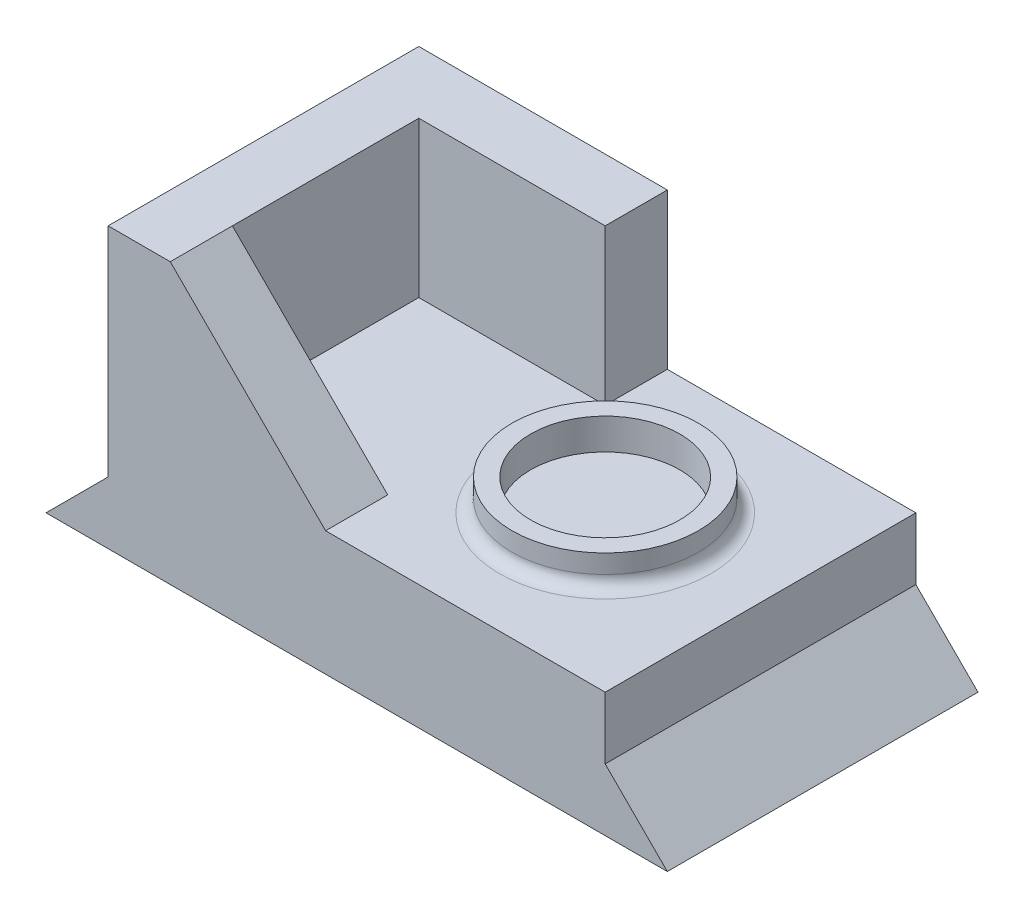
ISO-10303-21;
HEADER;
FILE_DESCRIPTION(('STEP AP214'),'2;1');
FILE_NAME('part.step','',(''),(''),'','','');
FILE_SCHEMA(('AUTOMOTIVE_DESIGN { 1 0 10303 214 1 1 1 1 }'));
ENDSEC;
DATA;
#1=APPLICATION_CONTEXT('core data for automotive mechanical design processes');
#2=APPLICATION_PROTOCOL_DEFINITION('international standard','automotive_design',2000,#1);
#3=PRODUCT_CONTEXT('',#1,'mechanical');
#4=PRODUCT('Part','Part','',(#3));
#5=PRODUCT_RELATED_PRODUCT_CATEGORY('part','',(#4));
#6=PRODUCT_DEFINITION_FORMATION('','',#4);
#7=PRODUCT_DEFINITION_CONTEXT('part definition',#1,'design');
#8=PRODUCT_DEFINITION('design','',#6,#7);
#9=PRODUCT_DEFINITION_SHAPE('','',#8);
#10=(LENGTH_UNIT() NAMED_UNIT(*) SI_UNIT(.MILLI.,.METRE.));
#11=(NAMED_UNIT(*) PLANE_ANGLE_UNIT() SI_UNIT($,.RADIAN.));
#12=(NAMED_UNIT(*) SI_UNIT($,.STERADIAN.) SOLID_ANGLE_UNIT());
#13=UNCERTAINTY_MEASURE_WITH_UNIT(LENGTH_MEASURE(1.E-05),#10,'distance_accuracy_value','');
#14=(GEOMETRIC_REPRESENTATION_CONTEXT(3) GLOBAL_UNCERTAINTY_ASSIGNED_CONTEXT((#13)) GLOBAL_UNIT_ASSIGNED_CONTEXT((#10,
#11,#12)) REPRESENTATION_CONTEXT('',''));
#15=CARTESIAN_POINT('',(0.,0.,0.));
#16=DIRECTION('',(0.,0.,1.));
#17=DIRECTION('',(1.,0.,0.));
#18=AXIS2_PLACEMENT_3D('',#15,#16,#17);
#19=CARTESIAN_POINT('',(0.,20.,50.));
#20=DIRECTION('',(0.,-1.,0.));
#21=DIRECTION('',(1.,0.,0.));
#22=AXIS2_PLACEMENT_3D('',#19,#20,#21);
#23=PLANE('',#22);
#24=CARTESIAN_POINT('',(65.,20.,25.));
#25=DIRECTION('',(0.,-1.,0.));
#26=DIRECTION('',(1.,0.,0.));
#27=AXIS2_PLACEMENT_3D('',#24,#25,#26);
#28=CIRCLE('',#27,17.);
#29=CARTESIAN_POINT('',(82.,20.,25.));
#30=VERTEX_POINT('',#29);
#31=EDGE_CURVE('E11',#30,#30,#28,.T.);
#32=ORIENTED_EDGE('',*,*,#31,.T.);
#33=EDGE_LOOP('',(#32));
#34=FACE_BOUND('',#33,.T.);
#35=DIRECTION('',(0.,0.,-1.));
#36=VECTOR('',#35,1.);
#37=CARTESIAN_POINT('',(20.,20.,0.));
#38=LINE('',#37,#36);
#39=CARTESIAN_POINT('',(20.,20.,40.));
#40=VERTEX_POINT('',#39);
#41=CARTESIAN_POINT('',(20.,20.,10.));
#42=VERTEX_POINT('',#41);
#43=EDGE_CURVE('E298',#40,#42,#38,.T.);
#44=ORIENTED_EDGE('',*,*,#43,.F.);
#45=DIRECTION('',(1.,0.,0.));
#46=VECTOR('',#45,1.);
#47=CARTESIAN_POINT('',(0.,20.,40.));
#48=LINE('',#47,#46);
#49=CARTESIAN_POINT('',(45.,20.,40.));
#50=VERTEX_POINT('',#49);
#51=EDGE_CURVE('E135',#40,#50,#48,.T.);
#52=ORIENTED_EDGE('',*,*,#51,.T.);
#53=DIRECTION('',(0.,0.,1.));
#54=VECTOR('',#53,1.);
#55=CARTESIAN_POINT('',(45.,20.,40.));
#56=LINE('',#55,#54);
#57=CARTESIAN_POINT('',(45.,20.,50.));
#58=VERTEX_POINT('',#57);
#59=EDGE_CURVE('E131',#50,#58,#56,.T.);
#60=ORIENTED_EDGE('',*,*,#59,.T.);
#61=DIRECTION('',(-1.,0.,0.));
#62=VECTOR('',#61,1.);
#63=CARTESIAN_POINT('',(0.,20.,50.));
#64=LINE('',#63,#62);
#65=CARTESIAN_POINT('',(90.,20.,50.));
#66=VERTEX_POINT('',#65);
#67=EDGE_CURVE('E195',#66,#58,#64,.T.);
#68=ORIENTED_EDGE('',*,*,#67,.F.);
#69=DIRECTION('',(0.,0.,-1.));
#70=VECTOR('',#69,1.);
#71=CARTESIAN_POINT('',(90.,20.,50.));
#72=LINE('',#71,#70);
#73=CARTESIAN_POINT('',(90.,20.,0.));
#74=VERTEX_POINT('',#73);
#75=EDGE_CURVE('E198',#66,#74,#72,.T.);
#76=ORIENTED_EDGE('',*,*,#75,.T.);
#77=DIRECTION('',(-1.,0.,0.));
#78=VECTOR('',#77,1.);
#79=CARTESIAN_POINT('',(0.,20.,0.));
#80=LINE('',#79,#78);
#81=CARTESIAN_POINT('',(50.,20.,0.));
#82=VERTEX_POINT('',#81);
#83=EDGE_CURVE('E187',#74,#82,#80,.T.);
#84=ORIENTED_EDGE('',*,*,#83,.T.);
#85=DIRECTION('',(0.,0.,-1.));
#86=VECTOR('',#85,1.);
#87=CARTESIAN_POINT('',(50.,20.,0.));
#88=LINE('',#87,#86);
#89=CARTESIAN_POINT('',(50.,20.,10.));
#90=VERTEX_POINT('',#89);
#91=EDGE_CURVE('E54',#90,#82,#88,.T.);
#92=ORIENTED_EDGE('',*,*,#91,.F.);
#93=DIRECTION('',(1.,0.,0.));
#94=VECTOR('',#93,1.);
#95=CARTESIAN_POINT('',(0.,20.,10.));
#96=LINE('',#95,#94);
#97=EDGE_CURVE('E59',#42,#90,#96,.T.);
#98=ORIENTED_EDGE('',*,*,#97,.F.);
#99=EDGE_LOOP('',(#44,#52,#60,#68,#76,#84,#92,#98));
#100=FACE_BOUND('',#99,.T.);
#101=ADVANCED_FACE('F39',(#34,#100),#23,.F.);
#102=CARTESIAN_POINT('',(0.,0.,40.));
#103=DIRECTION('',(0.,0.,1.));
#104=DIRECTION('',(1.,0.,0.));
#105=AXIS2_PLACEMENT_3D('',#102,#103,#104);
#106=PLANE('',#105);
#107=DIRECTION('',(0.,-1.,0.));
#108=VECTOR('',#107,1.);
#109=CARTESIAN_POINT('',(20.,101.568542494924,40.));
#110=LINE('',#109,#108);
#111=CARTESIAN_POINT('',(20.,45.,40.));
#112=VERTEX_POINT('',#111);
#113=EDGE_CURVE('E148',#112,#40,#110,.T.);
#114=ORIENTED_EDGE('',*,*,#113,.F.);
#115=DIRECTION('',(0.707106781186547,-0.707106781186548,0.));
#116=VECTOR('',#115,1.);
#117=CARTESIAN_POINT('',(32.5,32.5,40.));
#118=LINE('',#117,#116);
#119=EDGE_CURVE('E125',#112,#50,#118,.T.);
#120=ORIENTED_EDGE('',*,*,#119,.T.);
#121=ORIENTED_EDGE('',*,*,#51,.F.);
#122=EDGE_LOOP('',(#114,#120,#121));
#123=FACE_BOUND('',#122,.T.);
#124=ADVANCED_FACE('F149',(#123),#106,.F.);
#125=CARTESIAN_POINT('',(10.,0.,50.));
#126=DIRECTION('',(1.,0.,0.));
#127=DIRECTION('',(0.,1.,0.));
#128=AXIS2_PLACEMENT_3D('',#125,#126,#127);
#129=PLANE('',#128);
#130=DIRECTION('',(0.,0.,1.));
#131=VECTOR('',#130,1.);
#132=CARTESIAN_POINT('',(10.,45.,40.));
#133=LINE('',#132,#131);
#134=CARTESIAN_POINT('',(9.99999999999999,45.,0.));
#135=VERTEX_POINT('',#134);
#136=CARTESIAN_POINT('',(10.,45.,50.));
#137=VERTEX_POINT('',#136);
#138=EDGE_CURVE('E145',#135,#137,#133,.T.);
#139=ORIENTED_EDGE('',*,*,#138,.F.);
#140=DIRECTION('',(0.,-1.,0.));
#141=VECTOR('',#140,1.);
#142=CARTESIAN_POINT('',(10.,0.,0.));
#143=LINE('',#142,#141);
#144=CARTESIAN_POINT('',(10.,10.,0.));
#145=VERTEX_POINT('',#144);
#146=EDGE_CURVE('E182',#135,#145,#143,.T.);
#147=ORIENTED_EDGE('',*,*,#146,.T.);
#148=DIRECTION('',(0.,0.,-1.));
#149=VECTOR('',#148,1.);
#150=CARTESIAN_POINT('',(10.,10.,50.));
#151=LINE('',#150,#149);
#152=CARTESIAN_POINT('',(10.,10.,50.));
#153=VERTEX_POINT('',#152);
#154=EDGE_CURVE('E221',#153,#145,#151,.T.);
#155=ORIENTED_EDGE('',*,*,#154,.F.);
#156=DIRECTION('',(0.,-1.,0.));
#157=VECTOR('',#156,1.);
#158=CARTESIAN_POINT('',(10.,0.,50.));
#159=LINE('',#158,#157);
#160=EDGE_CURVE('E183',#137,#153,#159,.T.);
#161=ORIENTED_EDGE('',*,*,#160,.F.);
#162=EDGE_LOOP('',(#139,#147,#155,#161));
#163=FACE_BOUND('',#162,.T.);
#164=ADVANCED_FACE('F246',(#163),#129,.F.);
#165=CARTESIAN_POINT('',(0.,0.,50.));
#166=DIRECTION('',(0.707106781186548,-0.707106781186548,0.));
#167=DIRECTION('',(0.707106781186548,0.707106781186548,0.));
#168=AXIS2_PLACEMENT_3D('',#165,#166,#167);
#169=PLANE('',#168);
#170=DIRECTION('',(-0.707106781186548,-0.707106781186548,0.));
#171=VECTOR('',#170,1.);
#172=CARTESIAN_POINT('',(0.,0.,0.));
#173=LINE('',#172,#171);
#174=CARTESIAN_POINT('',(0.,0.,0.));
#175=VERTEX_POINT('',#174);
#176=EDGE_CURVE('E201',#145,#175,#173,.T.);
#177=ORIENTED_EDGE('',*,*,#176,.T.);
#178=DIRECTION('',(0.,0.,-1.));
#179=VECTOR('',#178,1.);
#180=CARTESIAN_POINT('',(0.,0.,50.));
#181=LINE('',#180,#179);
#182=CARTESIAN_POINT('',(0.,0.,50.));
#183=VERTEX_POINT('',#182);
#184=EDGE_CURVE('E218',#183,#175,#181,.T.);
#185=ORIENTED_EDGE('',*,*,#184,.F.);
#186=DIRECTION('',(-0.707106781186548,-0.707106781186548,0.));
#187=VECTOR('',#186,1.);
#188=CARTESIAN_POINT('',(0.,0.,50.));
#189=LINE('',#188,#187);
#190=EDGE_CURVE('E186',#153,#183,#189,.T.);
#191=ORIENTED_EDGE('',*,*,#190,.F.);
#192=ORIENTED_EDGE('',*,*,#154,.T.);
#193=EDGE_LOOP('',(#177,#185,#191,#192));
#194=FACE_BOUND('',#193,.T.);
#195=ADVANCED_FACE('F318',(#194),#169,.F.);
#196=CARTESIAN_POINT('',(0.,0.,50.));
#197=DIRECTION('',(0.,1.,0.));
#198=DIRECTION('',(0.,0.,1.));
#199=AXIS2_PLACEMENT_3D('',#196,#197,#198);
#200=PLANE('',#199);
#201=DIRECTION('',(1.,0.,0.));
#202=VECTOR('',#201,1.);
#203=CARTESIAN_POINT('',(0.,0.,0.));
#204=LINE('',#203,#202);
#205=CARTESIAN_POINT('',(100.,0.,0.));
#206=VERTEX_POINT('',#205);
#207=EDGE_CURVE('E203',#175,#206,#204,.T.);
#208=ORIENTED_EDGE('',*,*,#207,.T.);
#209=DIRECTION('',(0.,0.,-1.));
#210=VECTOR('',#209,1.);
#211=CARTESIAN_POINT('',(100.,0.,50.));
#212=LINE('',#211,#210);
#213=CARTESIAN_POINT('',(100.,0.,50.));
#214=VERTEX_POINT('',#213);
#215=EDGE_CURVE('E215',#214,#206,#212,.T.);
#216=ORIENTED_EDGE('',*,*,#215,.F.);
#217=DIRECTION('',(1.,0.,0.));
#218=VECTOR('',#217,1.);
#219=CARTESIAN_POINT('',(0.,0.,50.));
#220=LINE('',#219,#218);
#221=EDGE_CURVE('E189',#183,#214,#220,.T.);
#222=ORIENTED_EDGE('',*,*,#221,.F.);
#223=ORIENTED_EDGE('',*,*,#184,.T.);
#224=EDGE_LOOP('',(#208,#216,#222,#223));
#225=FACE_BOUND('',#224,.T.);
#226=ADVANCED_FACE('F315',(#225),#200,.F.);
#227=CARTESIAN_POINT('',(50.,50.,50.));
#228=DIRECTION('',(-0.707106781186548,-0.707106781186547,0.));
#229=DIRECTION('',(0.707106781186547,-0.707106781186548,0.));
#230=AXIS2_PLACEMENT_3D('',#227,#228,#229);
#231=PLANE('',#230);
#232=DIRECTION('',(-0.707106781186547,0.707106781186548,0.));
#233=VECTOR('',#232,1.);
#234=CARTESIAN_POINT('',(50.,50.,0.));
#235=LINE('',#234,#233);
#236=CARTESIAN_POINT('',(90.,9.99999999999999,0.));
#237=VERTEX_POINT('',#236);
#238=EDGE_CURVE('E205',#206,#237,#235,.T.);
#239=ORIENTED_EDGE('',*,*,#238,.T.);
#240=DIRECTION('',(0.,0.,-1.));
#241=VECTOR('',#240,1.);
#242=CARTESIAN_POINT('',(90.,9.99999999999999,50.));
#243=LINE('',#242,#241);
#244=CARTESIAN_POINT('',(90.,9.99999999999999,50.));
#245=VERTEX_POINT('',#244);
#246=EDGE_CURVE('E212',#245,#237,#243,.T.);
#247=ORIENTED_EDGE('',*,*,#246,.F.);
#248=DIRECTION('',(-0.707106781186547,0.707106781186548,0.));
#249=VECTOR('',#248,1.);
#250=CARTESIAN_POINT('',(50.,50.,50.));
#251=LINE('',#250,#249);
#252=EDGE_CURVE('E191',#214,#245,#251,.T.);
#253=ORIENTED_EDGE('',*,*,#252,.F.);
#254=ORIENTED_EDGE('',*,*,#215,.T.);
#255=EDGE_LOOP('',(#239,#247,#253,#254));
#256=FACE_BOUND('',#255,.T.);
#257=ADVANCED_FACE('F311',(#256),#231,.F.);
#258=CARTESIAN_POINT('',(90.,0.,50.));
#259=DIRECTION('',(-1.,0.,0.));
#260=DIRECTION('',(0.,0.,1.));
#261=AXIS2_PLACEMENT_3D('',#258,#259,#260);
#262=PLANE('',#261);
#263=DIRECTION('',(0.,1.,0.));
#264=VECTOR('',#263,1.);
#265=CARTESIAN_POINT('',(90.,0.,0.));
#266=LINE('',#265,#264);
#267=EDGE_CURVE('E207',#237,#74,#266,.T.);
#268=ORIENTED_EDGE('',*,*,#267,.T.);
#269=ORIENTED_EDGE('',*,*,#75,.F.);
#270=DIRECTION('',(0.,1.,0.));
#271=VECTOR('',#270,1.);
#272=CARTESIAN_POINT('',(90.,0.,50.));
#273=LINE('',#272,#271);
#274=EDGE_CURVE('E193',#245,#66,#273,.T.);
#275=ORIENTED_EDGE('',*,*,#274,.F.);
#276=ORIENTED_EDGE('',*,*,#246,.T.);
#277=EDGE_LOOP('',(#268,#269,#275,#276));
#278=FACE_BOUND('',#277,.T.);
#279=ADVANCED_FACE('F278',(#278),#262,.F.);
#280=CARTESIAN_POINT('',(0.,0.,50.));
#281=DIRECTION('',(0.,0.,1.));
#282=DIRECTION('',(1.,0.,0.));
#283=AXIS2_PLACEMENT_3D('',#280,#281,#282);
#284=PLANE('',#283);
#285=ORIENTED_EDGE('',*,*,#160,.T.);
#286=ORIENTED_EDGE('',*,*,#190,.T.);
#287=ORIENTED_EDGE('',*,*,#221,.T.);
#288=ORIENTED_EDGE('',*,*,#252,.T.);
#289=ORIENTED_EDGE('',*,*,#274,.T.);
#290=ORIENTED_EDGE('',*,*,#67,.T.);
#291=DIRECTION('',(0.707106781186547,-0.707106781186548,0.));
#292=VECTOR('',#291,1.);
#293=CARTESIAN_POINT('',(32.5,32.5,50.));
#294=LINE('',#293,#292);
#295=CARTESIAN_POINT('',(20.,45.,50.));
#296=VERTEX_POINT('',#295);
#297=EDGE_CURVE('E173',#296,#58,#294,.T.);
#298=ORIENTED_EDGE('',*,*,#297,.F.);
#299=DIRECTION('',(1.,0.,0.));
#300=VECTOR('',#299,1.);
#301=CARTESIAN_POINT('',(0.,45.,50.));
#302=LINE('',#301,#300);
#303=EDGE_CURVE('E136',#137,#296,#302,.T.);
#304=ORIENTED_EDGE('',*,*,#303,.F.);
#305=EDGE_LOOP('',(#285,#286,#287,#288,#289,#290,#298,#304));
#306=FACE_BOUND('',#305,.T.);
#307=ADVANCED_FACE('F276',(#306),#284,.T.);
#308=CARTESIAN_POINT('',(0.,0.,0.));
#309=DIRECTION('',(0.,0.,1.));
#310=DIRECTION('',(1.,0.,0.));
#311=AXIS2_PLACEMENT_3D('',#308,#309,#310);
#312=PLANE('',#311);
#313=ORIENTED_EDGE('',*,*,#146,.F.);
#314=DIRECTION('',(1.,0.,0.));
#315=VECTOR('',#314,1.);
#316=CARTESIAN_POINT('',(0.,45.,0.));
#317=LINE('',#316,#315);
#318=CARTESIAN_POINT('',(50.,45.,0.));
#319=VERTEX_POINT('',#318);
#320=EDGE_CURVE('E157',#135,#319,#317,.T.);
#321=ORIENTED_EDGE('',*,*,#320,.T.);
#322=DIRECTION('',(0.,-1.,0.));
#323=VECTOR('',#322,1.);
#324=CARTESIAN_POINT('',(50.,101.568542494924,0.));
#325=LINE('',#324,#323);
#326=EDGE_CURVE('E152',#319,#82,#325,.T.);
#327=ORIENTED_EDGE('',*,*,#326,.T.);
#328=ORIENTED_EDGE('',*,*,#83,.F.);
#329=ORIENTED_EDGE('',*,*,#267,.F.);
#330=ORIENTED_EDGE('',*,*,#238,.F.);
#331=ORIENTED_EDGE('',*,*,#207,.F.);
#332=ORIENTED_EDGE('',*,*,#176,.F.);
#333=EDGE_LOOP('',(#313,#321,#327,#328,#329,#330,#331,#332));
#334=FACE_BOUND('',#333,.T.);
#335=ADVANCED_FACE('F275',(#334),#312,.F.);
#336=CARTESIAN_POINT('',(32.5,32.5,40.));
#337=DIRECTION('',(-0.707106781186548,-0.707106781186547,0.));
#338=DIRECTION('',(0.707106781186547,-0.707106781186548,0.));
#339=AXIS2_PLACEMENT_3D('',#336,#337,#338);
#340=PLANE('',#339);
#341=ORIENTED_EDGE('',*,*,#297,.T.);
#342=ORIENTED_EDGE('',*,*,#59,.F.);
#343=ORIENTED_EDGE('',*,*,#119,.F.);
#344=DIRECTION('',(0.,0.,1.));
#345=VECTOR('',#344,1.);
#346=CARTESIAN_POINT('',(20.,45.,40.));
#347=LINE('',#346,#345);
#348=EDGE_CURVE('E128',#112,#296,#347,.T.);
#349=ORIENTED_EDGE('',*,*,#348,.T.);
#350=EDGE_LOOP('',(#341,#342,#343,#349));
#351=FACE_BOUND('',#350,.T.);
#352=ADVANCED_FACE('F127',(#351),#340,.F.);
#353=CARTESIAN_POINT('',(0.,45.,40.));
#354=DIRECTION('',(0.,-1.,0.));
#355=DIRECTION('',(0.,0.,-1.));
#356=AXIS2_PLACEMENT_3D('',#353,#354,#355);
#357=PLANE('',#356);
#358=ORIENTED_EDGE('',*,*,#303,.T.);
#359=ORIENTED_EDGE('',*,*,#348,.F.);
#360=DIRECTION('',(0.,0.,1.));
#361=VECTOR('',#360,1.);
#362=CARTESIAN_POINT('',(20.,45.,0.));
#363=LINE('',#362,#361);
#364=CARTESIAN_POINT('',(20.,45.,10.));
#365=VERTEX_POINT('',#364);
#366=EDGE_CURVE('E141',#365,#112,#363,.T.);
#367=ORIENTED_EDGE('',*,*,#366,.F.);
#368=DIRECTION('',(-1.,0.,0.));
#369=VECTOR('',#368,1.);
#370=CARTESIAN_POINT('',(0.,45.,10.));
#371=LINE('',#370,#369);
#372=CARTESIAN_POINT('',(50.,45.,10.));
#373=VERTEX_POINT('',#372);
#374=EDGE_CURVE('E175',#373,#365,#371,.T.);
#375=ORIENTED_EDGE('',*,*,#374,.F.);
#376=DIRECTION('',(0.,0.,1.));
#377=VECTOR('',#376,1.);
#378=CARTESIAN_POINT('',(50.,45.,0.));
#379=LINE('',#378,#377);
#380=EDGE_CURVE('E161',#319,#373,#379,.T.);
#381=ORIENTED_EDGE('',*,*,#380,.F.);
#382=ORIENTED_EDGE('',*,*,#320,.F.);
#383=ORIENTED_EDGE('',*,*,#138,.T.);
#384=EDGE_LOOP('',(#358,#359,#367,#375,#381,#382,#383));
#385=FACE_BOUND('',#384,.T.);
#386=ADVANCED_FACE('F139',(#385),#357,.F.);
#387=CARTESIAN_POINT('',(65.,25.,25.));
#388=DIRECTION('',(0.,-1.,0.));
#389=DIRECTION('',(1.,0.,0.));
#390=AXIS2_PLACEMENT_3D('',#387,#388,#389);
#391=CYLINDRICAL_SURFACE('',#390,12.);
#392=CARTESIAN_POINT('',(65.,25.,25.));
#393=DIRECTION('',(0.,1.,0.));
#394=DIRECTION('',(-1.,0.,0.));
#395=AXIS2_PLACEMENT_3D('',#392,#393,#394);
#396=CIRCLE('',#395,12.);
#397=CARTESIAN_POINT('',(53.,25.,25.));
#398=VERTEX_POINT('',#397);
#399=EDGE_CURVE('E166',#398,#398,#396,.T.);
#400=ORIENTED_EDGE('',*,*,#399,.T.);
#401=EDGE_LOOP('',(#400));
#402=FACE_BOUND('',#401,.T.);
#403=CARTESIAN_POINT('',(65.,20.,25.));
#404=DIRECTION('',(0.,1.,0.));
#405=DIRECTION('',(-1.,0.,0.));
#406=AXIS2_PLACEMENT_3D('',#403,#404,#405);
#407=CIRCLE('',#406,12.);
#408=CARTESIAN_POINT('',(53.,20.,25.));
#409=VERTEX_POINT('',#408);
#410=EDGE_CURVE('E170',#409,#409,#407,.T.);
#411=ORIENTED_EDGE('',*,*,#410,.F.);
#412=EDGE_LOOP('',(#411));
#413=FACE_BOUND('',#412,.T.);
#414=ADVANCED_FACE('F262',(#402,#413),#391,.F.);
#415=CARTESIAN_POINT('',(65.,25.,25.));
#416=DIRECTION('',(0.,-1.,0.));
#417=DIRECTION('',(1.,0.,0.));
#418=AXIS2_PLACEMENT_3D('',#415,#416,#417);
#419=CYLINDRICAL_SURFACE('',#418,15.);
#420=CARTESIAN_POINT('',(65.,22.,25.));
#421=DIRECTION('',(0.,-1.,0.));
#422=DIRECTION('',(1.,0.,0.));
#423=AXIS2_PLACEMENT_3D('',#420,#421,#422);
#424=CIRCLE('',#423,15.);
#425=CARTESIAN_POINT('',(80.,22.,25.));
#426=VERTEX_POINT('',#425);
#427=EDGE_CURVE('E47',#426,#426,#424,.F.);
#428=ORIENTED_EDGE('',*,*,#427,.T.);
#429=EDGE_LOOP('',(#428));
#430=FACE_BOUND('',#429,.T.);
#431=CARTESIAN_POINT('',(65.,25.,25.));
#432=DIRECTION('',(0.,1.,0.));
#433=DIRECTION('',(-1.,0.,0.));
#434=AXIS2_PLACEMENT_3D('',#431,#432,#433);
#435=CIRCLE('',#434,15.);
#436=CARTESIAN_POINT('',(50.,25.,25.));
#437=VERTEX_POINT('',#436);
#438=EDGE_CURVE('E169',#437,#437,#435,.T.);
#439=ORIENTED_EDGE('',*,*,#438,.F.);
#440=EDGE_LOOP('',(#439));
#441=FACE_BOUND('',#440,.T.);
#442=ADVANCED_FACE('F226',(#430,#441),#419,.T.);
#443=CARTESIAN_POINT('',(0.,25.,0.));
#444=DIRECTION('',(0.,1.,0.));
#445=DIRECTION('',(-1.,0.,0.));
#446=AXIS2_PLACEMENT_3D('',#443,#444,#445);
#447=PLANE('',#446);
#448=ORIENTED_EDGE('',*,*,#399,.F.);
#449=EDGE_LOOP('',(#448));
#450=FACE_BOUND('',#449,.T.);
#451=ORIENTED_EDGE('',*,*,#438,.T.);
#452=EDGE_LOOP('',(#451));
#453=FACE_BOUND('',#452,.T.);
#454=ADVANCED_FACE('F251',(#450,#453),#447,.T.);
#455=ORIENTED_EDGE('',*,*,#410,.T.);
#456=EDGE_LOOP('',(#455));
#457=FACE_BOUND('',#456,.T.);
#458=ADVANCED_FACE('F242',(#457),#23,.F.);
#459=CARTESIAN_POINT('',(20.,101.568542494924,0.));
#460=DIRECTION('',(-1.,0.,0.));
#461=DIRECTION('',(0.,-1.,0.));
#462=AXIS2_PLACEMENT_3D('',#459,#460,#461);
#463=PLANE('',#462);
#464=DIRECTION('',(0.,-1.,0.));
#465=VECTOR('',#464,1.);
#466=CARTESIAN_POINT('',(20.,101.568542494924,10.));
#467=LINE('',#466,#465);
#468=EDGE_CURVE('E153',#365,#42,#467,.T.);
#469=ORIENTED_EDGE('',*,*,#468,.F.);
#470=ORIENTED_EDGE('',*,*,#366,.T.);
#471=ORIENTED_EDGE('',*,*,#113,.T.);
#472=ORIENTED_EDGE('',*,*,#43,.T.);
#473=EDGE_LOOP('',(#469,#470,#471,#472));
#474=FACE_BOUND('',#473,.T.);
#475=ADVANCED_FACE('F156',(#474),#463,.F.);
#476=CARTESIAN_POINT('',(50.,101.568542494924,0.));
#477=DIRECTION('',(-1.,0.,0.));
#478=DIRECTION('',(0.,0.,1.));
#479=AXIS2_PLACEMENT_3D('',#476,#477,#478);
#480=PLANE('',#479);
#481=ORIENTED_EDGE('',*,*,#326,.F.);
#482=ORIENTED_EDGE('',*,*,#380,.T.);
#483=DIRECTION('',(0.,-1.,0.));
#484=VECTOR('',#483,1.);
#485=CARTESIAN_POINT('',(50.,101.568542494924,10.));
#486=LINE('',#485,#484);
#487=EDGE_CURVE('E158',#373,#90,#486,.T.);
#488=ORIENTED_EDGE('',*,*,#487,.T.);
#489=ORIENTED_EDGE('',*,*,#91,.T.);
#490=EDGE_LOOP('',(#481,#482,#488,#489));
#491=FACE_BOUND('',#490,.T.);
#492=ADVANCED_FACE('F235',(#491),#480,.F.);
#493=CARTESIAN_POINT('',(0.,101.568542494924,10.));
#494=DIRECTION('',(0.,0.,-1.));
#495=DIRECTION('',(-1.,0.,0.));
#496=AXIS2_PLACEMENT_3D('',#493,#494,#495);
#497=PLANE('',#496);
#498=ORIENTED_EDGE('',*,*,#487,.F.);
#499=ORIENTED_EDGE('',*,*,#374,.T.);
#500=ORIENTED_EDGE('',*,*,#468,.T.);
#501=ORIENTED_EDGE('',*,*,#97,.T.);
#502=EDGE_LOOP('',(#498,#499,#500,#501));
#503=FACE_BOUND('',#502,.T.);
#504=ADVANCED_FACE('F230',(#503),#497,.F.);
#505=CARTESIAN_POINT('',(65.,22.,25.));
#506=DIRECTION('',(0.,-1.,0.));
#507=DIRECTION('',(1.,0.,0.));
#508=AXIS2_PLACEMENT_3D('',#505,#506,#507);
#509=TOROIDAL_SURFACE('',#508,17.,2.);
#510=ORIENTED_EDGE('',*,*,#31,.F.);
#511=EDGE_LOOP('',(#510));
#512=FACE_BOUND('',#511,.T.);
#513=ORIENTED_EDGE('',*,*,#427,.F.);
#514=EDGE_LOOP('',(#513));
#515=FACE_BOUND('',#514,.T.);
#516=ADVANCED_FACE('F41',(#512,#515),#509,.F.);
#517=CLOSED_SHELL('',(#101,#124,#164,#195,#226,#257,#279,#307,#335,#352,#386,#414,#442,#454,
#458,#475,#492,#504,#516));
#518=MANIFOLD_SOLID_BREP('B2',#517);
#519=ADVANCED_BREP_SHAPE_REPRESENTATION('',(#18,#518),#14);
#520=SHAPE_DEFINITION_REPRESENTATION(#9,#519);
ENDSEC;
END-ISO-10303-21;
